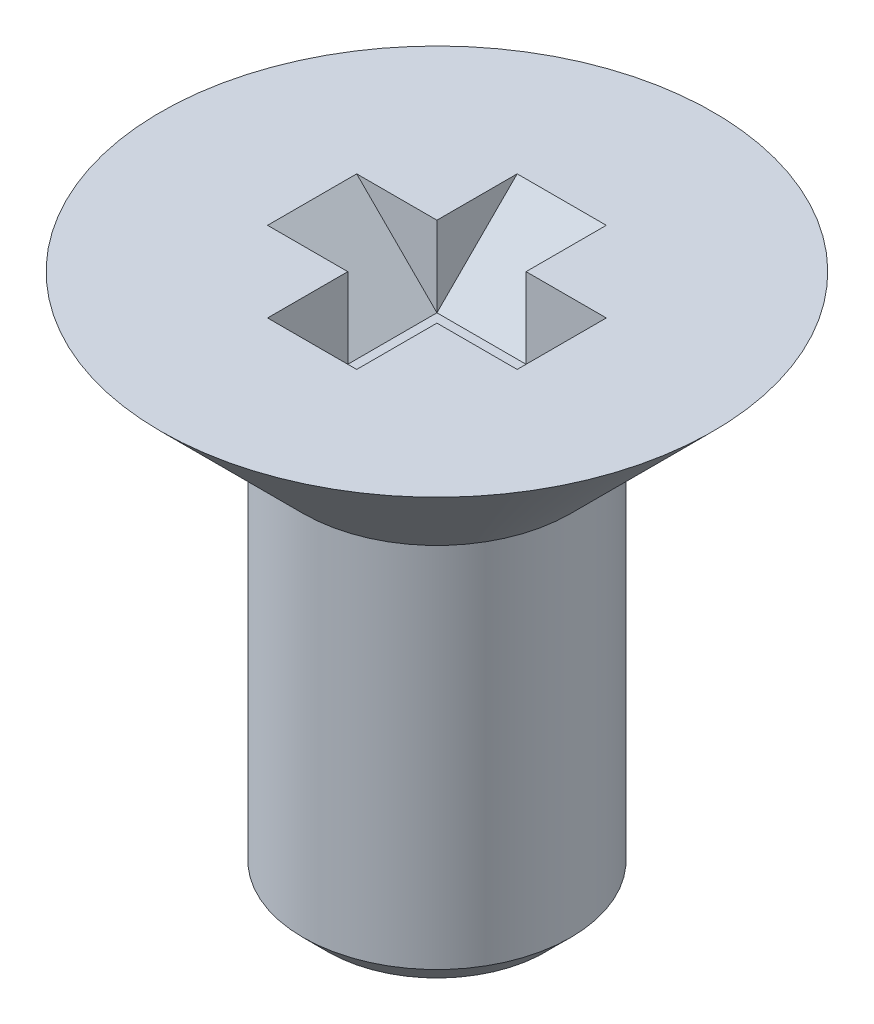
ISO-10303-21;
HEADER;
FILE_DESCRIPTION(('STEP AP214'),'2;1');
FILE_NAME('part.step','',(''),(''),'','','');
FILE_SCHEMA(('AUTOMOTIVE_DESIGN { 1 0 10303 214 1 1 1 1 }'));
ENDSEC;
DATA;
#1=APPLICATION_CONTEXT('core data for automotive mechanical design processes');
#2=APPLICATION_PROTOCOL_DEFINITION('international standard','automotive_design',2000,#1);
#3=PRODUCT_CONTEXT('',#1,'mechanical');
#4=PRODUCT('Part','Part','',(#3));
#5=PRODUCT_RELATED_PRODUCT_CATEGORY('part','',(#4));
#6=PRODUCT_DEFINITION_FORMATION('','',#4);
#7=PRODUCT_DEFINITION_CONTEXT('part definition',#1,'design');
#8=PRODUCT_DEFINITION('design','',#6,#7);
#9=PRODUCT_DEFINITION_SHAPE('','',#8);
#10=(LENGTH_UNIT() NAMED_UNIT(*) SI_UNIT(.MILLI.,.METRE.));
#11=(NAMED_UNIT(*) PLANE_ANGLE_UNIT() SI_UNIT($,.RADIAN.));
#12=(NAMED_UNIT(*) SI_UNIT($,.STERADIAN.) SOLID_ANGLE_UNIT());
#13=UNCERTAINTY_MEASURE_WITH_UNIT(LENGTH_MEASURE(1.E-05),#10,'distance_accuracy_value','');
#14=(GEOMETRIC_REPRESENTATION_CONTEXT(3) GLOBAL_UNCERTAINTY_ASSIGNED_CONTEXT((#13)) GLOBAL_UNIT_ASSIGNED_CONTEXT((#10,
#11,#12)) REPRESENTATION_CONTEXT('',''));
#15=CARTESIAN_POINT('',(0.,0.,0.));
#16=DIRECTION('',(0.,0.,1.));
#17=DIRECTION('',(1.,0.,0.));
#18=AXIS2_PLACEMENT_3D('',#15,#16,#17);
#19=CARTESIAN_POINT('',(0.,0.,0.));
#20=DIRECTION('',(0.,-1.,0.));
#21=DIRECTION('',(0.,0.,-1.));
#22=AXIS2_PLACEMENT_3D('',#19,#20,#21);
#23=PLANE('',#22);
#24=CARTESIAN_POINT('',(0.,0.,0.));
#25=DIRECTION('',(0.,1.,0.));
#26=DIRECTION('',(0.,0.,1.));
#27=AXIS2_PLACEMENT_3D('',#24,#25,#26);
#28=CIRCLE('',#27,3.10000000000002);
#29=CARTESIAN_POINT('',(0.,0.,3.10000000000002));
#30=VERTEX_POINT('',#29);
#31=EDGE_CURVE('E155',#30,#30,#28,.T.);
#32=ORIENTED_EDGE('',*,*,#31,.T.);
#33=EDGE_LOOP('',(#32));
#34=FACE_BOUND('',#33,.T.);
#35=DIRECTION('',(0.,0.,-1.));
#36=VECTOR('',#35,1.);
#37=CARTESIAN_POINT('',(-0.499999999999994,0.,-1.39999999999996));
#38=LINE('',#37,#36);
#39=CARTESIAN_POINT('',(-0.500000000000018,0.,1.39999999999998));
#40=VERTEX_POINT('',#39);
#41=CARTESIAN_POINT('',(-0.500000000000007,0.,0.500000000000042));
#42=VERTEX_POINT('',#41);
#43=EDGE_CURVE('E135',#40,#42,#38,.T.);
#44=ORIENTED_EDGE('',*,*,#43,.T.);
#45=DIRECTION('',(-1.,0.,0.));
#46=VECTOR('',#45,1.);
#47=CARTESIAN_POINT('',(-1.39999999999999,0.,0.500000000000084));
#48=LINE('',#47,#46);
#49=CARTESIAN_POINT('',(-1.39999999999999,0.,0.500000000000084));
#50=VERTEX_POINT('',#49);
#51=EDGE_CURVE('E53',#42,#50,#48,.T.);
#52=ORIENTED_EDGE('',*,*,#51,.T.);
#53=DIRECTION('',(0.,0.,1.));
#54=VECTOR('',#53,1.);
#55=CARTESIAN_POINT('',(-1.39999999999999,0.,-0.499999999999959));
#56=LINE('',#55,#54);
#57=CARTESIAN_POINT('',(-1.39999999999999,0.,-0.499999999999959));
#58=VERTEX_POINT('',#57);
#59=EDGE_CURVE('E112',#58,#50,#56,.T.);
#60=ORIENTED_EDGE('',*,*,#59,.F.);
#61=DIRECTION('',(-1.,0.,0.));
#62=VECTOR('',#61,1.);
#63=CARTESIAN_POINT('',(-1.39999999999999,0.,-0.499999999999959));
#64=LINE('',#63,#62);
#65=CARTESIAN_POINT('',(-0.500000000000004,0.,-0.499999999999952));
#66=VERTEX_POINT('',#65);
#67=EDGE_CURVE('E61',#66,#58,#64,.T.);
#68=ORIENTED_EDGE('',*,*,#67,.F.);
#69=CARTESIAN_POINT('',(-0.499999999999994,0.,-1.39999999999996));
#70=VERTEX_POINT('',#69);
#71=EDGE_CURVE('E194',#66,#70,#38,.T.);
#72=ORIENTED_EDGE('',*,*,#71,.T.);
#73=DIRECTION('',(-1.,0.,0.));
#74=VECTOR('',#73,1.);
#75=CARTESIAN_POINT('',(0.500000000000007,0.,-1.39999999999996));
#76=LINE('',#75,#74);
#77=CARTESIAN_POINT('',(0.500000000000007,0.,-1.39999999999996));
#78=VERTEX_POINT('',#77);
#79=EDGE_CURVE('E208',#78,#70,#76,.T.);
#80=ORIENTED_EDGE('',*,*,#79,.F.);
#81=DIRECTION('',(0.,0.,-1.));
#82=VECTOR('',#81,1.);
#83=CARTESIAN_POINT('',(0.500000000000007,0.,-1.39999999999996));
#84=LINE('',#83,#82);
#85=CARTESIAN_POINT('',(0.499999999999997,0.,-0.49999999999998));
#86=VERTEX_POINT('',#85);
#87=EDGE_CURVE('E197',#86,#78,#84,.T.);
#88=ORIENTED_EDGE('',*,*,#87,.F.);
#89=DIRECTION('',(1.,0.,0.));
#90=VECTOR('',#89,1.);
#91=CARTESIAN_POINT('',(1.39999999999998,0.,-0.49999999999998));
#92=LINE('',#91,#90);
#93=CARTESIAN_POINT('',(1.39999999999998,0.,-0.49999999999998));
#94=VERTEX_POINT('',#93);
#95=EDGE_CURVE('E217',#86,#94,#92,.T.);
#96=ORIENTED_EDGE('',*,*,#95,.T.);
#97=DIRECTION('',(0.,0.,-1.));
#98=VECTOR('',#97,1.);
#99=CARTESIAN_POINT('',(1.39999999999998,0.,0.5));
#100=LINE('',#99,#98);
#101=CARTESIAN_POINT('',(1.39999999999998,0.,0.5));
#102=VERTEX_POINT('',#101);
#103=EDGE_CURVE('E230',#102,#94,#100,.T.);
#104=ORIENTED_EDGE('',*,*,#103,.F.);
#105=DIRECTION('',(1.,0.,0.));
#106=VECTOR('',#105,1.);
#107=CARTESIAN_POINT('',(1.39999999999998,0.,0.5));
#108=LINE('',#107,#106);
#109=CARTESIAN_POINT('',(0.499999999999994,0.,0.500000000000063));
#110=VERTEX_POINT('',#109);
#111=EDGE_CURVE('E231',#110,#102,#108,.T.);
#112=ORIENTED_EDGE('',*,*,#111,.F.);
#113=DIRECTION('',(0.,0.,1.));
#114=VECTOR('',#113,1.);
#115=CARTESIAN_POINT('',(0.499999999999983,0.,1.39999999999999));
#116=LINE('',#115,#114);
#117=CARTESIAN_POINT('',(0.499999999999983,0.,1.39999999999999));
#118=VERTEX_POINT('',#117);
#119=EDGE_CURVE('E240',#110,#118,#116,.T.);
#120=ORIENTED_EDGE('',*,*,#119,.T.);
#121=DIRECTION('',(1.,0.,0.));
#122=VECTOR('',#121,1.);
#123=CARTESIAN_POINT('',(-0.500000000000018,0.,1.39999999999998));
#124=LINE('',#123,#122);
#125=EDGE_CURVE('E136',#40,#118,#124,.T.);
#126=ORIENTED_EDGE('',*,*,#125,.F.);
#127=EDGE_LOOP('',(#44,#52,#60,#68,#72,#80,#88,#96,#104,#112,#120,#126));
#128=FACE_BOUND('',#127,.T.);
#129=ADVANCED_FACE('F38',(#34,#128),#23,.F.);
#130=CARTESIAN_POINT('',(0.,-1.4,-0.49999999999998));
#131=DIRECTION('',(-0.707106781186551,-0.707106781186544,0.));
#132=DIRECTION('',(0.707106781186544,-0.707106781186551,0.));
#133=AXIS2_PLACEMENT_3D('',#130,#131,#132);
#134=PLANE('',#133);
#135=DIRECTION('',(0.,0.,1.));
#136=VECTOR('',#135,1.);
#137=CARTESIAN_POINT('',(-0.500000000000004,-0.899999999999998,-0.499999999999952));
#138=LINE('',#137,#136);
#139=CARTESIAN_POINT('',(-0.500000000000004,-0.899999999999995,-0.499999999999952));
#140=VERTEX_POINT('',#139);
#141=CARTESIAN_POINT('',(-0.500000000000007,-0.899999999999991,0.500000000000042));
#142=VERTEX_POINT('',#141);
#143=EDGE_CURVE('E111',#140,#142,#138,.T.);
#144=ORIENTED_EDGE('',*,*,#143,.F.);
#145=DIRECTION('',(0.707106781186544,-0.707106781186551,0.));
#146=VECTOR('',#145,1.);
#147=CARTESIAN_POINT('',(0.,-1.4,-0.49999999999998));
#148=LINE('',#147,#146);
#149=EDGE_CURVE('E149',#58,#140,#148,.T.);
#150=ORIENTED_EDGE('',*,*,#149,.F.);
#151=ORIENTED_EDGE('',*,*,#59,.T.);
#152=DIRECTION('',(0.707106781186544,-0.707106781186551,0.));
#153=VECTOR('',#152,1.);
#154=CARTESIAN_POINT('',(-2.84494650060196E-13,-1.4,0.5));
#155=LINE('',#154,#153);
#156=EDGE_CURVE('E107',#50,#142,#155,.T.);
#157=ORIENTED_EDGE('',*,*,#156,.T.);
#158=EDGE_LOOP('',(#144,#150,#151,#157));
#159=FACE_BOUND('',#158,.T.);
#160=ADVANCED_FACE('F109',(#159),#134,.F.);
#161=CARTESIAN_POINT('',(0.,0.,-0.49999999999998));
#162=DIRECTION('',(0.,0.,-1.));
#163=DIRECTION('',(-1.,0.,0.));
#164=AXIS2_PLACEMENT_3D('',#161,#162,#163);
#165=PLANE('',#164);
#166=DIRECTION('',(0.,-1.,0.));
#167=VECTOR('',#166,1.);
#168=CARTESIAN_POINT('',(-0.500000000000004,0.,-0.499999999999952));
#169=LINE('',#168,#167);
#170=EDGE_CURVE('E139',#66,#140,#169,.T.);
#171=ORIENTED_EDGE('',*,*,#170,.F.);
#172=ORIENTED_EDGE('',*,*,#67,.T.);
#173=ORIENTED_EDGE('',*,*,#149,.T.);
#174=EDGE_LOOP('',(#171,#172,#173));
#175=FACE_BOUND('',#174,.T.);
#176=ADVANCED_FACE('F183',(#175),#165,.F.);
#177=CARTESIAN_POINT('',(-2.8796409701215E-13,0.,0.5));
#178=DIRECTION('',(0.,0.,-1.));
#179=DIRECTION('',(-1.,0.,0.));
#180=AXIS2_PLACEMENT_3D('',#177,#178,#179);
#181=PLANE('',#180);
#182=ORIENTED_EDGE('',*,*,#51,.F.);
#183=DIRECTION('',(0.,-1.,0.));
#184=VECTOR('',#183,1.);
#185=CARTESIAN_POINT('',(-0.500000000000007,0.,0.500000000000042));
#186=LINE('',#185,#184);
#187=EDGE_CURVE('E115',#42,#142,#186,.T.);
#188=ORIENTED_EDGE('',*,*,#187,.T.);
#189=ORIENTED_EDGE('',*,*,#156,.F.);
#190=EDGE_LOOP('',(#182,#188,#189));
#191=FACE_BOUND('',#190,.T.);
#192=ADVANCED_FACE('F117',(#191),#181,.T.);
#193=CARTESIAN_POINT('',(0.,-1.6,0.));
#194=DIRECTION('',(0.,1.,0.));
#195=DIRECTION('',(0.,0.,1.));
#196=AXIS2_PLACEMENT_3D('',#193,#194,#195);
#197=CONICAL_SURFACE('',#196,1.5,0.785398163397453);
#198=ORIENTED_EDGE('',*,*,#31,.F.);
#199=EDGE_LOOP('',(#198));
#200=FACE_BOUND('',#199,.T.);
#201=CARTESIAN_POINT('',(0.,-1.6,0.));
#202=DIRECTION('',(0.,1.,0.));
#203=DIRECTION('',(0.,0.,1.));
#204=AXIS2_PLACEMENT_3D('',#201,#202,#203);
#205=CIRCLE('',#204,1.5);
#206=CARTESIAN_POINT('',(0.,-1.6,1.5));
#207=VERTEX_POINT('',#206);
#208=EDGE_CURVE('E152',#207,#207,#205,.T.);
#209=ORIENTED_EDGE('',*,*,#208,.T.);
#210=EDGE_LOOP('',(#209));
#211=FACE_BOUND('',#210,.T.);
#212=ADVANCED_FACE('F173',(#200,#211),#197,.T.);
#213=CARTESIAN_POINT('',(0.,0.,0.));
#214=DIRECTION('',(0.,1.,0.));
#215=DIRECTION('',(0.,0.,1.));
#216=AXIS2_PLACEMENT_3D('',#213,#214,#215);
#217=CYLINDRICAL_SURFACE('',#216,1.5);
#218=CARTESIAN_POINT('',(0.,-5.7195,0.));
#219=DIRECTION('',(0.,1.,0.));
#220=DIRECTION('',(0.,0.,1.));
#221=AXIS2_PLACEMENT_3D('',#218,#219,#220);
#222=CIRCLE('',#221,1.5);
#223=CARTESIAN_POINT('',(0.,-5.7195,1.5));
#224=VERTEX_POINT('',#223);
#225=EDGE_CURVE('E158',#224,#224,#222,.T.);
#226=ORIENTED_EDGE('',*,*,#225,.T.);
#227=EDGE_LOOP('',(#226));
#228=FACE_BOUND('',#227,.T.);
#229=ORIENTED_EDGE('',*,*,#208,.F.);
#230=EDGE_LOOP('',(#229));
#231=FACE_BOUND('',#230,.T.);
#232=ADVANCED_FACE('F170',(#228,#231),#217,.T.);
#233=CARTESIAN_POINT('',(1.5,-6.,0.));
#234=DIRECTION('',(0.,1.,0.));
#235=DIRECTION('',(0.,0.,1.));
#236=AXIS2_PLACEMENT_3D('',#233,#234,#235);
#237=PLANE('',#236);
#238=CARTESIAN_POINT('',(0.,-6.,0.));
#239=DIRECTION('',(0.,1.,0.));
#240=DIRECTION('',(0.,0.,1.));
#241=AXIS2_PLACEMENT_3D('',#238,#239,#240);
#242=CIRCLE('',#241,1.2195);
#243=CARTESIAN_POINT('',(0.,-6.,1.2195));
#244=VERTEX_POINT('',#243);
#245=EDGE_CURVE('E120',#244,#244,#242,.F.);
#246=ORIENTED_EDGE('',*,*,#245,.T.);
#247=EDGE_LOOP('',(#246));
#248=FACE_BOUND('',#247,.T.);
#249=ADVANCED_FACE('F164',(#248),#237,.F.);
#250=CARTESIAN_POINT('',(0.,-5.7195,0.));
#251=DIRECTION('',(0.,1.,0.));
#252=DIRECTION('',(0.,0.,1.));
#253=AXIS2_PLACEMENT_3D('',#250,#251,#252);
#254=CONICAL_SURFACE('',#253,1.5,0.78539816339745);
#255=ORIENTED_EDGE('',*,*,#245,.F.);
#256=EDGE_LOOP('',(#255));
#257=FACE_BOUND('',#256,.T.);
#258=ORIENTED_EDGE('',*,*,#225,.F.);
#259=EDGE_LOOP('',(#258));
#260=FACE_BOUND('',#259,.T.);
#261=ADVANCED_FACE('F40',(#257,#260),#254,.T.);
#262=CARTESIAN_POINT('',(-0.5,0.,0.));
#263=DIRECTION('',(1.,0.,0.));
#264=DIRECTION('',(0.,0.,-1.));
#265=AXIS2_PLACEMENT_3D('',#262,#263,#264);
#266=PLANE('',#265);
#267=ORIENTED_EDGE('',*,*,#43,.F.);
#268=DIRECTION('',(0.,-0.707106781186551,-0.707106781186544));
#269=VECTOR('',#268,1.);
#270=CARTESIAN_POINT('',(-0.5,-1.4,0.));
#271=LINE('',#270,#269);
#272=EDGE_CURVE('E127',#40,#142,#271,.T.);
#273=ORIENTED_EDGE('',*,*,#272,.T.);
#274=ORIENTED_EDGE('',*,*,#187,.F.);
#275=EDGE_LOOP('',(#267,#273,#274));
#276=FACE_BOUND('',#275,.T.);
#277=ADVANCED_FACE('F134',(#276),#266,.T.);
#278=CARTESIAN_POINT('',(0.5,0.,0.));
#279=DIRECTION('',(1.,0.,0.));
#280=DIRECTION('',(0.,0.,-1.));
#281=AXIS2_PLACEMENT_3D('',#278,#279,#280);
#282=PLANE('',#281);
#283=ORIENTED_EDGE('',*,*,#87,.T.);
#284=DIRECTION('',(0.,-0.707106781186551,0.707106781186544));
#285=VECTOR('',#284,1.);
#286=CARTESIAN_POINT('',(0.5,-1.4,0.));
#287=LINE('',#286,#285);
#288=CARTESIAN_POINT('',(0.499999999999997,-0.899999999999991,-0.49999999999998));
#289=VERTEX_POINT('',#288);
#290=EDGE_CURVE('E205',#78,#289,#287,.T.);
#291=ORIENTED_EDGE('',*,*,#290,.T.);
#292=DIRECTION('',(0.,-1.,0.));
#293=VECTOR('',#292,1.);
#294=CARTESIAN_POINT('',(0.499999999999997,0.,-0.49999999999998));
#295=LINE('',#294,#293);
#296=EDGE_CURVE('E143',#86,#289,#295,.T.);
#297=ORIENTED_EDGE('',*,*,#296,.F.);
#298=EDGE_LOOP('',(#283,#291,#297));
#299=FACE_BOUND('',#298,.T.);
#300=ADVANCED_FACE('F221',(#299),#282,.F.);
#301=CARTESIAN_POINT('',(-0.5,-1.4,0.));
#302=DIRECTION('',(0.,-0.707106781186544,0.707106781186551));
#303=DIRECTION('',(0.,-0.707106781186551,-0.707106781186544));
#304=AXIS2_PLACEMENT_3D('',#301,#302,#303);
#305=PLANE('',#304);
#306=DIRECTION('',(-1.,0.,0.));
#307=VECTOR('',#306,1.);
#308=CARTESIAN_POINT('',(-2.94902990916057E-13,-0.899999999999995,0.5));
#309=LINE('',#308,#307);
#310=CARTESIAN_POINT('',(0.499999999999994,-0.900000000000001,0.500000000000063));
#311=VERTEX_POINT('',#310);
#312=EDGE_CURVE('E46',#311,#142,#309,.T.);
#313=ORIENTED_EDGE('',*,*,#312,.T.);
#314=ORIENTED_EDGE('',*,*,#272,.F.);
#315=ORIENTED_EDGE('',*,*,#125,.T.);
#316=DIRECTION('',(0.,-0.707106781186551,-0.707106781186544));
#317=VECTOR('',#316,1.);
#318=CARTESIAN_POINT('',(0.5,-1.4,0.));
#319=LINE('',#318,#317);
#320=EDGE_CURVE('E130',#118,#311,#319,.T.);
#321=ORIENTED_EDGE('',*,*,#320,.T.);
#322=EDGE_LOOP('',(#313,#314,#315,#321));
#323=FACE_BOUND('',#322,.T.);
#324=ADVANCED_FACE('F126',(#323),#305,.F.);
#325=CARTESIAN_POINT('',(0.5,0.,0.));
#326=DIRECTION('',(-1.,0.,0.));
#327=DIRECTION('',(0.,0.,1.));
#328=AXIS2_PLACEMENT_3D('',#325,#326,#327);
#329=PLANE('',#328);
#330=DIRECTION('',(0.,-1.,0.));
#331=VECTOR('',#330,1.);
#332=CARTESIAN_POINT('',(0.499999999999994,0.,0.500000000000063));
#333=LINE('',#332,#331);
#334=EDGE_CURVE('E200',#110,#311,#333,.T.);
#335=ORIENTED_EDGE('',*,*,#334,.T.);
#336=ORIENTED_EDGE('',*,*,#320,.F.);
#337=ORIENTED_EDGE('',*,*,#119,.F.);
#338=EDGE_LOOP('',(#335,#336,#337));
#339=FACE_BOUND('',#338,.T.);
#340=ADVANCED_FACE('F239',(#339),#329,.T.);
#341=CARTESIAN_POINT('',(0.,0.,-0.49999999999998));
#342=DIRECTION('',(0.,0.,1.));
#343=DIRECTION('',(1.,0.,0.));
#344=AXIS2_PLACEMENT_3D('',#341,#342,#343);
#345=PLANE('',#344);
#346=ORIENTED_EDGE('',*,*,#296,.T.);
#347=DIRECTION('',(-0.707106781186544,-0.707106781186551,0.));
#348=VECTOR('',#347,1.);
#349=CARTESIAN_POINT('',(0.,-1.4,-0.49999999999998));
#350=LINE('',#349,#348);
#351=EDGE_CURVE('E215',#94,#289,#350,.T.);
#352=ORIENTED_EDGE('',*,*,#351,.F.);
#353=ORIENTED_EDGE('',*,*,#95,.F.);
#354=EDGE_LOOP('',(#346,#352,#353));
#355=FACE_BOUND('',#354,.T.);
#356=ADVANCED_FACE('F213',(#355),#345,.T.);
#357=CARTESIAN_POINT('',(-2.8796409701215E-13,0.,0.5));
#358=DIRECTION('',(0.,0.,1.));
#359=DIRECTION('',(1.,0.,0.));
#360=AXIS2_PLACEMENT_3D('',#357,#358,#359);
#361=PLANE('',#360);
#362=ORIENTED_EDGE('',*,*,#111,.T.);
#363=DIRECTION('',(-0.707106781186544,-0.707106781186551,0.));
#364=VECTOR('',#363,1.);
#365=CARTESIAN_POINT('',(-2.8796409701215E-13,-1.4,0.5));
#366=LINE('',#365,#364);
#367=EDGE_CURVE('E228',#102,#311,#366,.T.);
#368=ORIENTED_EDGE('',*,*,#367,.T.);
#369=ORIENTED_EDGE('',*,*,#334,.F.);
#370=EDGE_LOOP('',(#362,#368,#369));
#371=FACE_BOUND('',#370,.T.);
#372=ADVANCED_FACE('F243',(#371),#361,.F.);
#373=CARTESIAN_POINT('',(-2.8796409701215E-13,-1.4,0.5));
#374=DIRECTION('',(0.707106781186551,-0.707106781186544,0.));
#375=DIRECTION('',(0.707106781186544,0.707106781186551,0.));
#376=AXIS2_PLACEMENT_3D('',#373,#374,#375);
#377=PLANE('',#376);
#378=ORIENTED_EDGE('',*,*,#367,.F.);
#379=ORIENTED_EDGE('',*,*,#103,.T.);
#380=ORIENTED_EDGE('',*,*,#351,.T.);
#381=DIRECTION('',(0.,0.,-1.));
#382=VECTOR('',#381,1.);
#383=CARTESIAN_POINT('',(0.5,-0.899999999999995,0.));
#384=LINE('',#383,#382);
#385=EDGE_CURVE('E140',#311,#289,#384,.T.);
#386=ORIENTED_EDGE('',*,*,#385,.F.);
#387=EDGE_LOOP('',(#378,#379,#380,#386));
#388=FACE_BOUND('',#387,.T.);
#389=ADVANCED_FACE('F226',(#388),#377,.F.);
#390=ORIENTED_EDGE('',*,*,#170,.T.);
#391=DIRECTION('',(0.,-0.707106781186551,0.707106781186544));
#392=VECTOR('',#391,1.);
#393=CARTESIAN_POINT('',(-0.5,-1.4,0.));
#394=LINE('',#393,#392);
#395=EDGE_CURVE('E193',#70,#140,#394,.T.);
#396=ORIENTED_EDGE('',*,*,#395,.F.);
#397=ORIENTED_EDGE('',*,*,#71,.F.);
#398=EDGE_LOOP('',(#390,#396,#397));
#399=FACE_BOUND('',#398,.T.);
#400=ADVANCED_FACE('F247',(#399),#266,.T.);
#401=CARTESIAN_POINT('',(0.5,-1.4,0.));
#402=DIRECTION('',(0.,-0.707106781186544,-0.707106781186551));
#403=DIRECTION('',(0.,0.707106781186551,-0.707106781186544));
#404=AXIS2_PLACEMENT_3D('',#401,#402,#403);
#405=PLANE('',#404);
#406=DIRECTION('',(-1.,0.,0.));
#407=VECTOR('',#406,1.);
#408=CARTESIAN_POINT('',(0.,-0.899999999999995,-0.49999999999998));
#409=LINE('',#408,#407);
#410=EDGE_CURVE('E11',#289,#140,#409,.T.);
#411=ORIENTED_EDGE('',*,*,#410,.F.);
#412=ORIENTED_EDGE('',*,*,#290,.F.);
#413=ORIENTED_EDGE('',*,*,#79,.T.);
#414=ORIENTED_EDGE('',*,*,#395,.T.);
#415=EDGE_LOOP('',(#411,#412,#413,#414));
#416=FACE_BOUND('',#415,.T.);
#417=ADVANCED_FACE('F245',(#416),#405,.F.);
#418=CARTESIAN_POINT('',(0.,-0.899999999999998,0.));
#419=DIRECTION('',(0.,1.,0.));
#420=DIRECTION('',(-1.,0.,0.));
#421=AXIS2_PLACEMENT_3D('',#418,#419,#420);
#422=PLANE('',#421);
#423=ORIENTED_EDGE('',*,*,#410,.T.);
#424=ORIENTED_EDGE('',*,*,#143,.T.);
#425=ORIENTED_EDGE('',*,*,#312,.F.);
#426=ORIENTED_EDGE('',*,*,#385,.T.);
#427=EDGE_LOOP('',(#423,#424,#425,#426));
#428=FACE_BOUND('',#427,.T.);
#429=ADVANCED_FACE('F138',(#428),#422,.T.);
#430=CLOSED_SHELL('',(#129,#160,#176,#192,#212,#232,#249,#261,#277,#300,#324,#340,#356,#372,
#389,#400,#417,#429));
#431=MANIFOLD_SOLID_BREP('B2',#430);
#432=ADVANCED_BREP_SHAPE_REPRESENTATION('',(#18,#431),#14);
#433=SHAPE_DEFINITION_REPRESENTATION(#9,#432);
ENDSEC;
END-ISO-10303-21;
